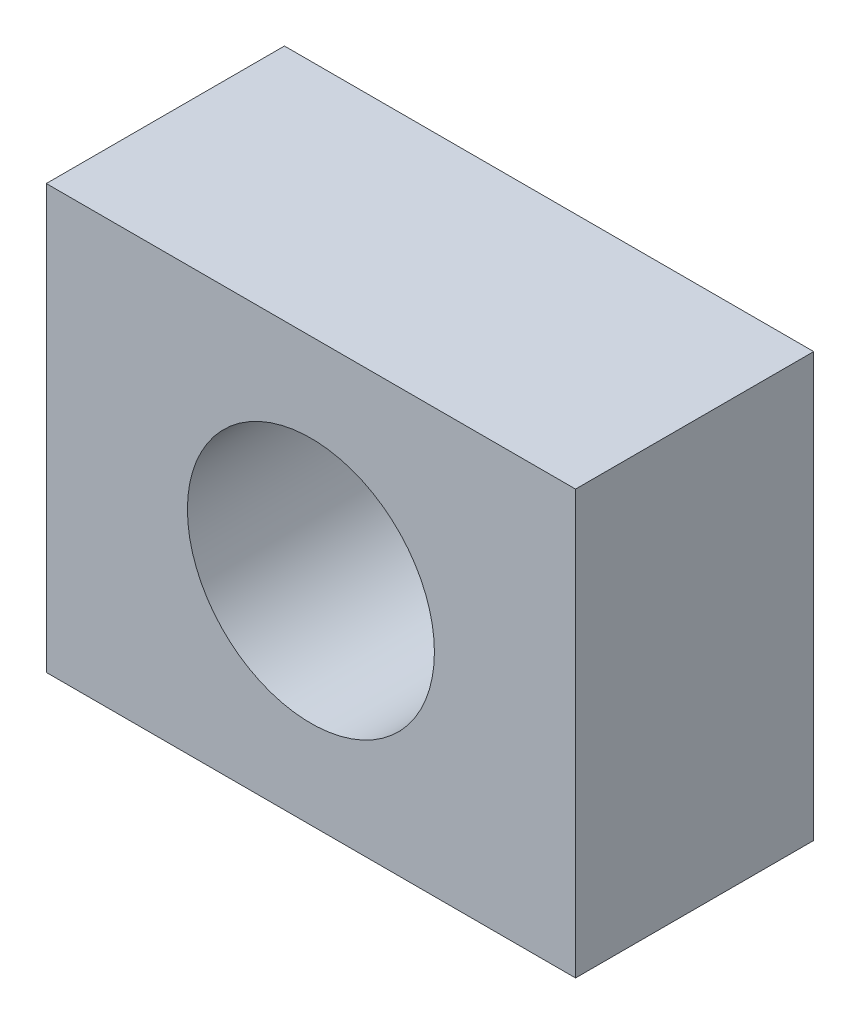
ISO-10303-21;
HEADER;
FILE_DESCRIPTION(('STEP AP214'),'2;1');
FILE_NAME('part.step','',(''),(''),'','','');
FILE_SCHEMA(('AUTOMOTIVE_DESIGN { 1 0 10303 214 1 1 1 1 }'));
ENDSEC;
DATA;
#1=APPLICATION_CONTEXT('core data for automotive mechanical design processes');
#2=APPLICATION_PROTOCOL_DEFINITION('international standard','automotive_design',2000,#1);
#3=PRODUCT_CONTEXT('',#1,'mechanical');
#4=PRODUCT('Part','Part','',(#3));
#5=PRODUCT_RELATED_PRODUCT_CATEGORY('part','',(#4));
#6=PRODUCT_DEFINITION_FORMATION('','',#4);
#7=PRODUCT_DEFINITION_CONTEXT('part definition',#1,'design');
#8=PRODUCT_DEFINITION('design','',#6,#7);
#9=PRODUCT_DEFINITION_SHAPE('','',#8);
#10=(LENGTH_UNIT() NAMED_UNIT(*) SI_UNIT(.MILLI.,.METRE.));
#11=(NAMED_UNIT(*) PLANE_ANGLE_UNIT() SI_UNIT($,.RADIAN.));
#12=(NAMED_UNIT(*) SI_UNIT($,.STERADIAN.) SOLID_ANGLE_UNIT());
#13=UNCERTAINTY_MEASURE_WITH_UNIT(LENGTH_MEASURE(1.E-05),#10,'distance_accuracy_value','');
#14=(GEOMETRIC_REPRESENTATION_CONTEXT(3) GLOBAL_UNCERTAINTY_ASSIGNED_CONTEXT((#13)) GLOBAL_UNIT_ASSIGNED_CONTEXT((#10,
#11,#12)) REPRESENTATION_CONTEXT('',''));
#15=CARTESIAN_POINT('',(0.,0.,0.));
#16=DIRECTION('',(0.,0.,1.));
#17=DIRECTION('',(1.,0.,0.));
#18=AXIS2_PLACEMENT_3D('',#15,#16,#17);
#19=CARTESIAN_POINT('',(15.,-12.,0.));
#20=DIRECTION('',(1.,0.,0.));
#21=DIRECTION('',(0.,0.,-1.));
#22=AXIS2_PLACEMENT_3D('',#19,#20,#21);
#23=PLANE('',#22);
#24=DIRECTION('',(0.,1.,0.));
#25=VECTOR('',#24,1.);
#26=CARTESIAN_POINT('',(15.,-12.,13.5));
#27=LINE('',#26,#25);
#28=CARTESIAN_POINT('',(15.,-12.,13.5));
#29=VERTEX_POINT('',#28);
#30=CARTESIAN_POINT('',(15.,12.,13.5));
#31=VERTEX_POINT('',#30);
#32=EDGE_CURVE('E76',#29,#31,#27,.T.);
#33=ORIENTED_EDGE('',*,*,#32,.F.);
#34=DIRECTION('',(0.,0.,1.));
#35=VECTOR('',#34,1.);
#36=CARTESIAN_POINT('',(15.,-12.,0.));
#37=LINE('',#36,#35);
#38=CARTESIAN_POINT('',(15.,-12.,0.));
#39=VERTEX_POINT('',#38);
#40=EDGE_CURVE('E11',#39,#29,#37,.T.);
#41=ORIENTED_EDGE('',*,*,#40,.F.);
#42=DIRECTION('',(0.,1.,0.));
#43=VECTOR('',#42,1.);
#44=CARTESIAN_POINT('',(15.,-12.,0.));
#45=LINE('',#44,#43);
#46=CARTESIAN_POINT('',(15.,12.,0.));
#47=VERTEX_POINT('',#46);
#48=EDGE_CURVE('E78',#39,#47,#45,.T.);
#49=ORIENTED_EDGE('',*,*,#48,.T.);
#50=DIRECTION('',(0.,0.,1.));
#51=VECTOR('',#50,1.);
#52=CARTESIAN_POINT('',(15.,12.,0.));
#53=LINE('',#52,#51);
#54=EDGE_CURVE('E39',#47,#31,#53,.T.);
#55=ORIENTED_EDGE('',*,*,#54,.T.);
#56=EDGE_LOOP('',(#33,#41,#49,#55));
#57=FACE_BOUND('',#56,.T.);
#58=ADVANCED_FACE('F36',(#57),#23,.T.);
#59=CARTESIAN_POINT('',(-15.,-12.,0.));
#60=DIRECTION('',(0.,-1.,0.));
#61=DIRECTION('',(0.,0.,-1.));
#62=AXIS2_PLACEMENT_3D('',#59,#60,#61);
#63=PLANE('',#62);
#64=DIRECTION('',(1.,0.,0.));
#65=VECTOR('',#64,1.);
#66=CARTESIAN_POINT('',(-15.,-12.,13.5));
#67=LINE('',#66,#65);
#68=CARTESIAN_POINT('',(-15.,-12.,13.5));
#69=VERTEX_POINT('',#68);
#70=EDGE_CURVE('E93',#69,#29,#67,.T.);
#71=ORIENTED_EDGE('',*,*,#70,.F.);
#72=DIRECTION('',(0.,0.,1.));
#73=VECTOR('',#72,1.);
#74=CARTESIAN_POINT('',(-15.,-12.,0.));
#75=LINE('',#74,#73);
#76=CARTESIAN_POINT('',(-15.,-12.,0.));
#77=VERTEX_POINT('',#76);
#78=EDGE_CURVE('E44',#77,#69,#75,.T.);
#79=ORIENTED_EDGE('',*,*,#78,.F.);
#80=DIRECTION('',(1.,0.,0.));
#81=VECTOR('',#80,1.);
#82=CARTESIAN_POINT('',(-15.,-12.,0.));
#83=LINE('',#82,#81);
#84=EDGE_CURVE('E83',#77,#39,#83,.T.);
#85=ORIENTED_EDGE('',*,*,#84,.T.);
#86=ORIENTED_EDGE('',*,*,#40,.T.);
#87=EDGE_LOOP('',(#71,#79,#85,#86));
#88=FACE_BOUND('',#87,.T.);
#89=ADVANCED_FACE('F113',(#88),#63,.T.);
#90=CARTESIAN_POINT('',(-15.,12.,0.));
#91=DIRECTION('',(-1.,0.,0.));
#92=DIRECTION('',(0.,0.,1.));
#93=AXIS2_PLACEMENT_3D('',#90,#91,#92);
#94=PLANE('',#93);
#95=DIRECTION('',(0.,-1.,0.));
#96=VECTOR('',#95,1.);
#97=CARTESIAN_POINT('',(-15.,12.,13.5));
#98=LINE('',#97,#96);
#99=CARTESIAN_POINT('',(-15.,12.,13.5));
#100=VERTEX_POINT('',#99);
#101=EDGE_CURVE('E90',#100,#69,#98,.T.);
#102=ORIENTED_EDGE('',*,*,#101,.F.);
#103=DIRECTION('',(0.,0.,1.));
#104=VECTOR('',#103,1.);
#105=CARTESIAN_POINT('',(-15.,12.,0.));
#106=LINE('',#105,#104);
#107=CARTESIAN_POINT('',(-15.,12.,0.));
#108=VERTEX_POINT('',#107);
#109=EDGE_CURVE('E82',#108,#100,#106,.T.);
#110=ORIENTED_EDGE('',*,*,#109,.F.);
#111=DIRECTION('',(0.,-1.,0.));
#112=VECTOR('',#111,1.);
#113=CARTESIAN_POINT('',(-15.,12.,0.));
#114=LINE('',#113,#112);
#115=EDGE_CURVE('E106',#108,#77,#114,.T.);
#116=ORIENTED_EDGE('',*,*,#115,.T.);
#117=ORIENTED_EDGE('',*,*,#78,.T.);
#118=EDGE_LOOP('',(#102,#110,#116,#117));
#119=FACE_BOUND('',#118,.T.);
#120=ADVANCED_FACE('F110',(#119),#94,.T.);
#121=CARTESIAN_POINT('',(15.,12.,0.));
#122=DIRECTION('',(0.,1.,0.));
#123=DIRECTION('',(0.,0.,1.));
#124=AXIS2_PLACEMENT_3D('',#121,#122,#123);
#125=PLANE('',#124);
#126=DIRECTION('',(-1.,0.,0.));
#127=VECTOR('',#126,1.);
#128=CARTESIAN_POINT('',(15.,12.,13.5));
#129=LINE('',#128,#127);
#130=EDGE_CURVE('E85',#31,#100,#129,.T.);
#131=ORIENTED_EDGE('',*,*,#130,.F.);
#132=ORIENTED_EDGE('',*,*,#54,.F.);
#133=DIRECTION('',(-1.,0.,0.));
#134=VECTOR('',#133,1.);
#135=CARTESIAN_POINT('',(15.,12.,0.));
#136=LINE('',#135,#134);
#137=EDGE_CURVE('E104',#47,#108,#136,.T.);
#138=ORIENTED_EDGE('',*,*,#137,.T.);
#139=ORIENTED_EDGE('',*,*,#109,.T.);
#140=EDGE_LOOP('',(#131,#132,#138,#139));
#141=FACE_BOUND('',#140,.T.);
#142=ADVANCED_FACE('F86',(#141),#125,.T.);
#143=CARTESIAN_POINT('',(15.,12.,0.));
#144=DIRECTION('',(0.,0.,1.));
#145=DIRECTION('',(1.,0.,0.));
#146=AXIS2_PLACEMENT_3D('',#143,#144,#145);
#147=PLANE('',#146);
#148=CARTESIAN_POINT('',(0.,0.,0.));
#149=DIRECTION('',(0.,0.,1.));
#150=DIRECTION('',(-1.,0.,0.));
#151=AXIS2_PLACEMENT_3D('',#148,#149,#150);
#152=CIRCLE('',#151,7.);
#153=CARTESIAN_POINT('',(-7.,0.,0.));
#154=VERTEX_POINT('',#153);
#155=EDGE_CURVE('E94',#154,#154,#152,.T.);
#156=ORIENTED_EDGE('',*,*,#155,.T.);
#157=EDGE_LOOP('',(#156));
#158=FACE_BOUND('',#157,.T.);
#159=ORIENTED_EDGE('',*,*,#48,.F.);
#160=ORIENTED_EDGE('',*,*,#84,.F.);
#161=ORIENTED_EDGE('',*,*,#115,.F.);
#162=ORIENTED_EDGE('',*,*,#137,.F.);
#163=EDGE_LOOP('',(#159,#160,#161,#162));
#164=FACE_BOUND('',#163,.T.);
#165=ADVANCED_FACE('F115',(#158,#164),#147,.F.);
#166=CARTESIAN_POINT('',(15.,12.,13.5));
#167=DIRECTION('',(0.,0.,1.));
#168=DIRECTION('',(1.,0.,0.));
#169=AXIS2_PLACEMENT_3D('',#166,#167,#168);
#170=PLANE('',#169);
#171=CARTESIAN_POINT('',(0.,0.,13.5));
#172=DIRECTION('',(0.,0.,1.));
#173=DIRECTION('',(-1.,0.,0.));
#174=AXIS2_PLACEMENT_3D('',#171,#172,#173);
#175=CIRCLE('',#174,7.);
#176=CARTESIAN_POINT('',(-7.,0.,13.5));
#177=VERTEX_POINT('',#176);
#178=EDGE_CURVE('E97',#177,#177,#175,.T.);
#179=ORIENTED_EDGE('',*,*,#178,.F.);
#180=EDGE_LOOP('',(#179));
#181=FACE_BOUND('',#180,.T.);
#182=ORIENTED_EDGE('',*,*,#32,.T.);
#183=ORIENTED_EDGE('',*,*,#130,.T.);
#184=ORIENTED_EDGE('',*,*,#101,.T.);
#185=ORIENTED_EDGE('',*,*,#70,.T.);
#186=EDGE_LOOP('',(#182,#183,#184,#185));
#187=FACE_BOUND('',#186,.T.);
#188=ADVANCED_FACE('F92',(#181,#187),#170,.T.);
#189=CARTESIAN_POINT('',(0.,0.,0.));
#190=DIRECTION('',(0.,0.,1.));
#191=DIRECTION('',(1.,0.,0.));
#192=AXIS2_PLACEMENT_3D('',#189,#190,#191);
#193=CYLINDRICAL_SURFACE('',#192,7.);
#194=ORIENTED_EDGE('',*,*,#155,.F.);
#195=EDGE_LOOP('',(#194));
#196=FACE_BOUND('',#195,.T.);
#197=ORIENTED_EDGE('',*,*,#178,.T.);
#198=EDGE_LOOP('',(#197));
#199=FACE_BOUND('',#198,.T.);
#200=ADVANCED_FACE('F123',(#196,#199),#193,.F.);
#201=CLOSED_SHELL('',(#58,#89,#120,#142,#165,#188,#200));
#202=MANIFOLD_SOLID_BREP('B2',#201);
#203=ADVANCED_BREP_SHAPE_REPRESENTATION('',(#18,#202),#14);
#204=SHAPE_DEFINITION_REPRESENTATION(#9,#203);
ENDSEC;
END-ISO-10303-21;
